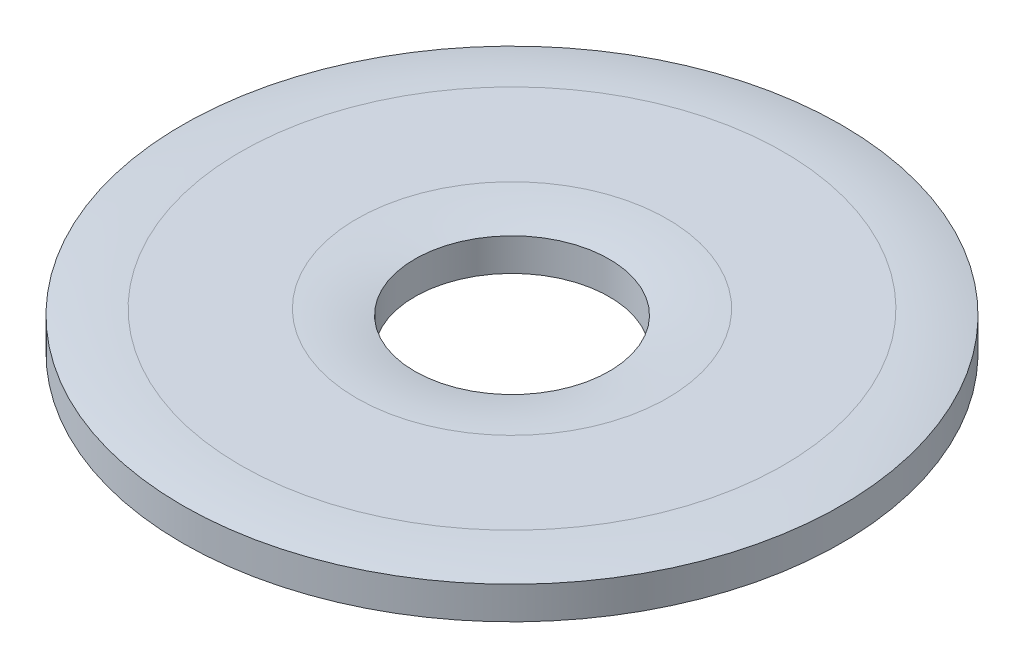
ISO-10303-21;
HEADER;
FILE_DESCRIPTION(('STEP AP214'),'2;1');
FILE_NAME('part.step','',(''),(''),'','','');
FILE_SCHEMA(('AUTOMOTIVE_DESIGN { 1 0 10303 214 1 1 1 1 }'));
ENDSEC;
DATA;
#1=APPLICATION_CONTEXT('core data for automotive mechanical design processes');
#2=APPLICATION_PROTOCOL_DEFINITION('international standard','automotive_design',2000,#1);
#3=PRODUCT_CONTEXT('',#1,'mechanical');
#4=PRODUCT('Part','Part','',(#3));
#5=PRODUCT_RELATED_PRODUCT_CATEGORY('part','',(#4));
#6=PRODUCT_DEFINITION_FORMATION('','',#4);
#7=PRODUCT_DEFINITION_CONTEXT('part definition',#1,'design');
#8=PRODUCT_DEFINITION('design','',#6,#7);
#9=PRODUCT_DEFINITION_SHAPE('','',#8);
#10=(LENGTH_UNIT() NAMED_UNIT(*) SI_UNIT(.MILLI.,.METRE.));
#11=(NAMED_UNIT(*) PLANE_ANGLE_UNIT() SI_UNIT($,.RADIAN.));
#12=(NAMED_UNIT(*) SI_UNIT($,.STERADIAN.) SOLID_ANGLE_UNIT());
#13=UNCERTAINTY_MEASURE_WITH_UNIT(LENGTH_MEASURE(1.E-05),#10,'distance_accuracy_value','');
#14=(GEOMETRIC_REPRESENTATION_CONTEXT(3) GLOBAL_UNCERTAINTY_ASSIGNED_CONTEXT((#13)) GLOBAL_UNIT_ASSIGNED_CONTEXT((#10,
#11,#12)) REPRESENTATION_CONTEXT('',''));
#15=CARTESIAN_POINT('',(0.,0.,0.));
#16=DIRECTION('',(0.,0.,1.));
#17=DIRECTION('',(1.,0.,0.));
#18=AXIS2_PLACEMENT_3D('',#15,#16,#17);
#19=CARTESIAN_POINT('',(0.,0.508,0.));
#20=DIRECTION('',(0.,1.,0.));
#21=DIRECTION('',(0.,0.,1.));
#22=AXIS2_PLACEMENT_3D('',#19,#20,#21);
#23=CYLINDRICAL_SURFACE('',#22,8.7376);
#24=CARTESIAN_POINT('',(0.,0.355599999999997,0.));
#25=DIRECTION('',(0.,1.,0.));
#26=DIRECTION('',(0.,0.,1.));
#27=AXIS2_PLACEMENT_3D('',#24,#25,#26);
#28=CIRCLE('',#27,8.7376);
#29=CARTESIAN_POINT('',(0.,0.355599999999997,8.7376));
#30=VERTEX_POINT('',#29);
#31=EDGE_CURVE('E62',#30,#30,#28,.T.);
#32=ORIENTED_EDGE('',*,*,#31,.F.);
#33=EDGE_LOOP('',(#32));
#34=FACE_BOUND('',#33,.T.);
#35=CARTESIAN_POINT('',(0.,-0.508000000000004,0.));
#36=DIRECTION('',(0.,1.,0.));
#37=DIRECTION('',(0.,0.,1.));
#38=AXIS2_PLACEMENT_3D('',#35,#36,#37);
#39=CIRCLE('',#38,8.7376);
#40=CARTESIAN_POINT('',(0.,-0.508000000000004,8.7376));
#41=VERTEX_POINT('',#40);
#42=EDGE_CURVE('E10',#41,#41,#39,.T.);
#43=ORIENTED_EDGE('',*,*,#42,.T.);
#44=EDGE_LOOP('',(#43));
#45=FACE_BOUND('',#44,.T.);
#46=ADVANCED_FACE('F34',(#34,#45),#23,.T.);
#47=CARTESIAN_POINT('',(0.,-0.508000000000004,-8.7376));
#48=DIRECTION('',(0.,1.,0.));
#49=DIRECTION('',(0.,0.,1.));
#50=AXIS2_PLACEMENT_3D('',#47,#48,#49);
#51=PLANE('',#50);
#52=ORIENTED_EDGE('',*,*,#42,.F.);
#53=EDGE_LOOP('',(#52));
#54=FACE_BOUND('',#53,.T.);
#55=CARTESIAN_POINT('',(0.,-0.508000000000005,0.));
#56=DIRECTION('',(0.,1.,0.));
#57=DIRECTION('',(0.,0.,1.));
#58=AXIS2_PLACEMENT_3D('',#55,#56,#57);
#59=CIRCLE('',#58,2.5781);
#60=CARTESIAN_POINT('',(0.,-0.508000000000005,2.5781));
#61=VERTEX_POINT('',#60);
#62=EDGE_CURVE('E41',#61,#61,#59,.T.);
#63=ORIENTED_EDGE('',*,*,#62,.T.);
#64=EDGE_LOOP('',(#63));
#65=FACE_BOUND('',#64,.T.);
#66=ADVANCED_FACE('F69',(#54,#65),#51,.F.);
#67=CARTESIAN_POINT('',(0.,0.508,0.));
#68=DIRECTION('',(0.,1.,0.));
#69=DIRECTION('',(0.,0.,1.));
#70=AXIS2_PLACEMENT_3D('',#67,#68,#69);
#71=CYLINDRICAL_SURFACE('',#70,2.5781);
#72=ORIENTED_EDGE('',*,*,#62,.F.);
#73=EDGE_LOOP('',(#72));
#74=FACE_BOUND('',#73,.T.);
#75=CARTESIAN_POINT('',(0.,0.355599999999995,0.));
#76=DIRECTION('',(0.,1.,0.));
#77=DIRECTION('',(0.,0.,1.));
#78=AXIS2_PLACEMENT_3D('',#75,#76,#77);
#79=CIRCLE('',#78,2.5781);
#80=CARTESIAN_POINT('',(0.,0.355599999999995,2.5781));
#81=VERTEX_POINT('',#80);
#82=EDGE_CURVE('E48',#81,#81,#79,.T.);
#83=ORIENTED_EDGE('',*,*,#82,.T.);
#84=EDGE_LOOP('',(#83));
#85=FACE_BOUND('',#84,.T.);
#86=ADVANCED_FACE('F73',(#74,#85),#71,.F.);
#87=CARTESIAN_POINT('',(0.,-7.34777682291661,0.));
#88=DIRECTION('',(0.,1.,0.));
#89=DIRECTION('',(0.,0.,1.));
#90=AXIS2_PLACEMENT_3D('',#87,#88,#89);
#91=DEGENERATE_TOROIDAL_SURFACE('',#90,4.117975,7.85577682291661,.T.);
#92=ORIENTED_EDGE('',*,*,#82,.F.);
#93=EDGE_LOOP('',(#92));
#94=FACE_BOUND('',#93,.T.);
#95=CARTESIAN_POINT('',(0.,0.507999999999995,0.));
#96=DIRECTION('',(0.,1.,0.));
#97=DIRECTION('',(0.,0.,1.));
#98=AXIS2_PLACEMENT_3D('',#95,#96,#97);
#99=CIRCLE('',#98,4.117975);
#100=CARTESIAN_POINT('',(0.,0.507999999999995,4.117975));
#101=VERTEX_POINT('',#100);
#102=EDGE_CURVE('E53',#101,#101,#99,.T.);
#103=ORIENTED_EDGE('',*,*,#102,.T.);
#104=EDGE_LOOP('',(#103));
#105=FACE_BOUND('',#104,.T.);
#106=ADVANCED_FACE('F78',(#94,#105),#91,.T.);
#107=CARTESIAN_POINT('',(0.,0.507999999999996,-4.117975));
#108=DIRECTION('',(0.,-1.,0.));
#109=DIRECTION('',(0.,0.,-1.));
#110=AXIS2_PLACEMENT_3D('',#107,#108,#109);
#111=PLANE('',#110);
#112=ORIENTED_EDGE('',*,*,#102,.F.);
#113=EDGE_LOOP('',(#112));
#114=FACE_BOUND('',#113,.T.);
#115=CARTESIAN_POINT('',(0.,0.507999999999997,0.));
#116=DIRECTION('',(0.,1.,0.));
#117=DIRECTION('',(0.,0.,1.));
#118=AXIS2_PLACEMENT_3D('',#115,#116,#117);
#119=CIRCLE('',#118,7.19772500000001);
#120=CARTESIAN_POINT('',(0.,0.507999999999997,7.19772500000001));
#121=VERTEX_POINT('',#120);
#122=EDGE_CURVE('E59',#121,#121,#119,.T.);
#123=ORIENTED_EDGE('',*,*,#122,.T.);
#124=EDGE_LOOP('',(#123));
#125=FACE_BOUND('',#124,.T.);
#126=ADVANCED_FACE('F84',(#114,#125),#111,.F.);
#127=CARTESIAN_POINT('',(0.,-7.34777682291661,0.));
#128=DIRECTION('',(0.,1.,0.));
#129=DIRECTION('',(0.,0.,1.));
#130=AXIS2_PLACEMENT_3D('',#127,#128,#129);
#131=DEGENERATE_TOROIDAL_SURFACE('',#130,7.19772500000001,7.85577682291661,.T.);
#132=ORIENTED_EDGE('',*,*,#122,.F.);
#133=EDGE_LOOP('',(#132));
#134=FACE_BOUND('',#133,.T.);
#135=ORIENTED_EDGE('',*,*,#31,.T.);
#136=EDGE_LOOP('',(#135));
#137=FACE_BOUND('',#136,.T.);
#138=ADVANCED_FACE('F66',(#134,#137),#131,.T.);
#139=CLOSED_SHELL('',(#46,#66,#86,#106,#126,#138));
#140=MANIFOLD_SOLID_BREP('B2',#139);
#141=ADVANCED_BREP_SHAPE_REPRESENTATION('',(#18,#140),#14);
#142=SHAPE_DEFINITION_REPRESENTATION(#9,#141);
ENDSEC;
END-ISO-10303-21;
